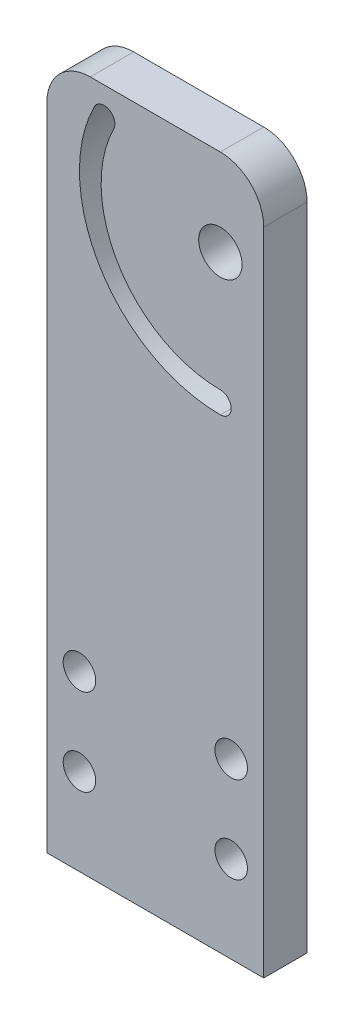
ISO-10303-21;
HEADER;
FILE_DESCRIPTION(('STEP AP214'),'2;1');
FILE_NAME('part.step','',(''),(''),'','','');
FILE_SCHEMA(('AUTOMOTIVE_DESIGN { 1 0 10303 214 1 1 1 1 }'));
ENDSEC;
DATA;
#1=APPLICATION_CONTEXT('core data for automotive mechanical design processes');
#2=APPLICATION_PROTOCOL_DEFINITION('international standard','automotive_design',2000,#1);
#3=PRODUCT_CONTEXT('',#1,'mechanical');
#4=PRODUCT('Part','Part','',(#3));
#5=PRODUCT_RELATED_PRODUCT_CATEGORY('part','',(#4));
#6=PRODUCT_DEFINITION_FORMATION('','',#4);
#7=PRODUCT_DEFINITION_CONTEXT('part definition',#1,'design');
#8=PRODUCT_DEFINITION('design','',#6,#7);
#9=PRODUCT_DEFINITION_SHAPE('','',#8);
#10=(LENGTH_UNIT() NAMED_UNIT(*) SI_UNIT(.MILLI.,.METRE.));
#11=(NAMED_UNIT(*) PLANE_ANGLE_UNIT() SI_UNIT($,.RADIAN.));
#12=(NAMED_UNIT(*) SI_UNIT($,.STERADIAN.) SOLID_ANGLE_UNIT());
#13=UNCERTAINTY_MEASURE_WITH_UNIT(LENGTH_MEASURE(1.E-05),#10,'distance_accuracy_value','');
#14=(GEOMETRIC_REPRESENTATION_CONTEXT(3) GLOBAL_UNCERTAINTY_ASSIGNED_CONTEXT((#13)) GLOBAL_UNIT_ASSIGNED_CONTEXT((#10,
#11,#12)) REPRESENTATION_CONTEXT('',''));
#15=CARTESIAN_POINT('',(0.,0.,0.));
#16=DIRECTION('',(0.,0.,1.));
#17=DIRECTION('',(1.,0.,0.));
#18=AXIS2_PLACEMENT_3D('',#15,#16,#17);
#19=CARTESIAN_POINT('',(0.,0.,6.35));
#20=DIRECTION('',(0.,0.,-1.));
#21=DIRECTION('',(-1.,0.,0.));
#22=AXIS2_PLACEMENT_3D('',#19,#20,#21);
#23=PLANE('',#22);
#24=CARTESIAN_POINT('',(26.9875,25.4,6.35));
#25=DIRECTION('',(0.,0.,1.));
#26=DIRECTION('',(1.,0.,0.));
#27=AXIS2_PLACEMENT_3D('',#24,#25,#26);
#28=CIRCLE('',#27,2.38125);
#29=CARTESIAN_POINT('',(29.36875,25.4,6.35));
#30=VERTEX_POINT('',#29);
#31=EDGE_CURVE('E343',#30,#30,#28,.T.);
#32=ORIENTED_EDGE('',*,*,#31,.F.);
#33=EDGE_LOOP('',(#32));
#34=FACE_BOUND('',#33,.T.);
#35=CARTESIAN_POINT('',(4.7625,12.7,6.35));
#36=DIRECTION('',(0.,0.,1.));
#37=DIRECTION('',(1.,0.,0.));
#38=AXIS2_PLACEMENT_3D('',#35,#36,#37);
#39=CIRCLE('',#38,2.38125);
#40=CARTESIAN_POINT('',(7.14375,12.7,6.35));
#41=VERTEX_POINT('',#40);
#42=EDGE_CURVE('E335',#41,#41,#39,.T.);
#43=ORIENTED_EDGE('',*,*,#42,.F.);
#44=EDGE_LOOP('',(#43));
#45=FACE_BOUND('',#44,.T.);
#46=CARTESIAN_POINT('',(26.9875,12.7,6.35));
#47=DIRECTION('',(0.,0.,1.));
#48=DIRECTION('',(1.,0.,0.));
#49=AXIS2_PLACEMENT_3D('',#46,#47,#48);
#50=CIRCLE('',#49,2.38125);
#51=CARTESIAN_POINT('',(29.36875,12.7,6.35));
#52=VERTEX_POINT('',#51);
#53=EDGE_CURVE('E330',#52,#52,#50,.T.);
#54=ORIENTED_EDGE('',*,*,#53,.F.);
#55=EDGE_LOOP('',(#54));
#56=FACE_BOUND('',#55,.T.);
#57=CARTESIAN_POINT('',(4.7625,25.4,6.35));
#58=DIRECTION('',(0.,0.,1.));
#59=DIRECTION('',(1.,0.,0.));
#60=AXIS2_PLACEMENT_3D('',#57,#58,#59);
#61=CIRCLE('',#60,2.38125);
#62=CARTESIAN_POINT('',(7.14375,25.4,6.35));
#63=VERTEX_POINT('',#62);
#64=EDGE_CURVE('E342',#63,#63,#61,.T.);
#65=ORIENTED_EDGE('',*,*,#64,.F.);
#66=EDGE_LOOP('',(#65));
#67=FACE_BOUND('',#66,.T.);
#68=CARTESIAN_POINT('',(25.4,88.9,6.35));
#69=DIRECTION('',(0.,0.,1.));
#70=DIRECTION('',(1.,0.,0.));
#71=AXIS2_PLACEMENT_3D('',#68,#69,#70);
#72=CIRCLE('',#71,3.175);
#73=CARTESIAN_POINT('',(28.575,88.9,6.35));
#74=VERTEX_POINT('',#73);
#75=EDGE_CURVE('E175',#74,#74,#72,.T.);
#76=ORIENTED_EDGE('',*,*,#75,.F.);
#77=EDGE_LOOP('',(#76));
#78=FACE_BOUND('',#77,.T.);
#79=DIRECTION('',(-1.,0.,0.));
#80=VECTOR('',#79,1.);
#81=CARTESIAN_POINT('',(0.,101.6,6.35));
#82=LINE('',#81,#80);
#83=CARTESIAN_POINT('',(25.4,101.6,6.35));
#84=VERTEX_POINT('',#83);
#85=CARTESIAN_POINT('',(6.35,101.6,6.35));
#86=VERTEX_POINT('',#85);
#87=EDGE_CURVE('E193',#84,#86,#82,.T.);
#88=ORIENTED_EDGE('',*,*,#87,.T.);
#89=CARTESIAN_POINT('',(6.35,95.25,6.35));
#90=DIRECTION('',(0.,0.,-1.));
#91=DIRECTION('',(-1.,0.,0.));
#92=AXIS2_PLACEMENT_3D('',#89,#90,#91);
#93=CIRCLE('',#92,6.35);
#94=CARTESIAN_POINT('',(0.,95.25,6.35));
#95=VERTEX_POINT('',#94);
#96=EDGE_CURVE('E48',#86,#95,#93,.F.);
#97=ORIENTED_EDGE('',*,*,#96,.T.);
#98=DIRECTION('',(0.,-1.,0.));
#99=VECTOR('',#98,1.);
#100=CARTESIAN_POINT('',(0.,0.,6.35));
#101=LINE('',#100,#99);
#102=CARTESIAN_POINT('',(0.,0.,6.35));
#103=VERTEX_POINT('',#102);
#104=EDGE_CURVE('E183',#95,#103,#101,.T.);
#105=ORIENTED_EDGE('',*,*,#104,.T.);
#106=DIRECTION('',(1.,0.,0.));
#107=VECTOR('',#106,1.);
#108=CARTESIAN_POINT('',(0.,0.,6.35));
#109=LINE('',#108,#107);
#110=CARTESIAN_POINT('',(31.75,0.,6.35));
#111=VERTEX_POINT('',#110);
#112=EDGE_CURVE('E186',#103,#111,#109,.T.);
#113=ORIENTED_EDGE('',*,*,#112,.T.);
#114=DIRECTION('',(0.,1.,0.));
#115=VECTOR('',#114,1.);
#116=CARTESIAN_POINT('',(31.75,0.,6.35));
#117=LINE('',#116,#115);
#118=CARTESIAN_POINT('',(31.75,95.25,6.35));
#119=VERTEX_POINT('',#118);
#120=EDGE_CURVE('E190',#111,#119,#117,.T.);
#121=ORIENTED_EDGE('',*,*,#120,.T.);
#122=CARTESIAN_POINT('',(25.4,95.25,6.35));
#123=DIRECTION('',(0.,0.,-1.));
#124=DIRECTION('',(-1.,0.,0.));
#125=AXIS2_PLACEMENT_3D('',#122,#123,#124);
#126=CIRCLE('',#125,6.35);
#127=EDGE_CURVE('E230',#119,#84,#126,.F.);
#128=ORIENTED_EDGE('',*,*,#127,.T.);
#129=EDGE_LOOP('',(#88,#97,#105,#113,#121,#128));
#130=FACE_BOUND('',#129,.T.);
#131=CARTESIAN_POINT('',(8.3611620114516,97.4194189942742,6.35));
#132=DIRECTION('',(0.,0.,1.));
#133=DIRECTION('',(1.,0.,0.));
#134=AXIS2_PLACEMENT_3D('',#131,#132,#133);
#135=CIRCLE('',#134,1.5875);
#136=CARTESIAN_POINT('',(9.78106517716398,96.709467411418,6.35));
#137=VERTEX_POINT('',#136);
#138=CARTESIAN_POINT('',(6.94125884573923,98.1293705771304,6.35));
#139=VERTEX_POINT('',#138);
#140=EDGE_CURVE('E120',#137,#139,#135,.T.);
#141=ORIENTED_EDGE('',*,*,#140,.F.);
#142=CARTESIAN_POINT('',(25.4,88.9,6.35));
#143=DIRECTION('',(0.,0.,-1.));
#144=DIRECTION('',(1.,0.,0.));
#145=AXIS2_PLACEMENT_3D('',#142,#143,#144);
#146=CIRCLE('',#145,17.4625);
#147=CARTESIAN_POINT('',(25.4,71.4375,6.35));
#148=VERTEX_POINT('',#147);
#149=EDGE_CURVE('E149',#148,#137,#146,.T.);
#150=ORIENTED_EDGE('',*,*,#149,.F.);
#151=CARTESIAN_POINT('',(25.4,69.85,6.35));
#152=DIRECTION('',(0.,0.,1.));
#153=DIRECTION('',(1.,0.,0.));
#154=AXIS2_PLACEMENT_3D('',#151,#152,#153);
#155=CIRCLE('',#154,1.58750000000001);
#156=CARTESIAN_POINT('',(25.4,68.2625,6.35));
#157=VERTEX_POINT('',#156);
#158=EDGE_CURVE('E145',#157,#148,#155,.T.);
#159=ORIENTED_EDGE('',*,*,#158,.F.);
#160=CARTESIAN_POINT('',(25.4,88.9,6.35));
#161=DIRECTION('',(0.,0.,1.));
#162=DIRECTION('',(1.,0.,0.));
#163=AXIS2_PLACEMENT_3D('',#160,#161,#162);
#164=CIRCLE('',#163,20.6375);
#165=EDGE_CURVE('E131',#139,#157,#164,.T.);
#166=ORIENTED_EDGE('',*,*,#165,.F.);
#167=EDGE_LOOP('',(#141,#150,#159,#166));
#168=FACE_BOUND('',#167,.T.);
#169=ADVANCED_FACE('F39',(#34,#45,#56,#67,#78,#130,#168),#23,.F.);
#170=CARTESIAN_POINT('',(0.,0.,0.));
#171=DIRECTION('',(0.,0.,-1.));
#172=DIRECTION('',(-1.,0.,0.));
#173=AXIS2_PLACEMENT_3D('',#170,#171,#172);
#174=PLANE('',#173);
#175=CARTESIAN_POINT('',(26.9875,25.4,0.));
#176=DIRECTION('',(0.,0.,1.));
#177=DIRECTION('',(1.,0.,0.));
#178=AXIS2_PLACEMENT_3D('',#175,#176,#177);
#179=CIRCLE('',#178,2.38125);
#180=CARTESIAN_POINT('',(29.36875,25.4,0.));
#181=VERTEX_POINT('',#180);
#182=EDGE_CURVE('E338',#181,#181,#179,.T.);
#183=ORIENTED_EDGE('',*,*,#182,.T.);
#184=EDGE_LOOP('',(#183));
#185=FACE_BOUND('',#184,.T.);
#186=CARTESIAN_POINT('',(4.7625,12.7,0.));
#187=DIRECTION('',(0.,0.,1.));
#188=DIRECTION('',(1.,0.,0.));
#189=AXIS2_PLACEMENT_3D('',#186,#187,#188);
#190=CIRCLE('',#189,2.38125);
#191=CARTESIAN_POINT('',(7.14375,12.7,0.));
#192=VERTEX_POINT('',#191);
#193=EDGE_CURVE('E347',#192,#192,#190,.T.);
#194=ORIENTED_EDGE('',*,*,#193,.T.);
#195=EDGE_LOOP('',(#194));
#196=FACE_BOUND('',#195,.T.);
#197=CARTESIAN_POINT('',(26.9875,12.7,0.));
#198=DIRECTION('',(0.,0.,1.));
#199=DIRECTION('',(1.,0.,0.));
#200=AXIS2_PLACEMENT_3D('',#197,#198,#199);
#201=CIRCLE('',#200,2.38125);
#202=CARTESIAN_POINT('',(29.36875,12.7,0.));
#203=VERTEX_POINT('',#202);
#204=EDGE_CURVE('E327',#203,#203,#201,.T.);
#205=ORIENTED_EDGE('',*,*,#204,.T.);
#206=EDGE_LOOP('',(#205));
#207=FACE_BOUND('',#206,.T.);
#208=CARTESIAN_POINT('',(4.7625,25.4,0.));
#209=DIRECTION('',(0.,0.,1.));
#210=DIRECTION('',(1.,0.,0.));
#211=AXIS2_PLACEMENT_3D('',#208,#209,#210);
#212=CIRCLE('',#211,2.38125);
#213=CARTESIAN_POINT('',(7.14375,25.4,0.));
#214=VERTEX_POINT('',#213);
#215=EDGE_CURVE('E158',#214,#214,#212,.T.);
#216=ORIENTED_EDGE('',*,*,#215,.T.);
#217=EDGE_LOOP('',(#216));
#218=FACE_BOUND('',#217,.T.);
#219=DIRECTION('',(0.,-1.,0.));
#220=VECTOR('',#219,1.);
#221=CARTESIAN_POINT('',(0.,0.,0.));
#222=LINE('',#221,#220);
#223=CARTESIAN_POINT('',(0.,95.25,0.));
#224=VERTEX_POINT('',#223);
#225=CARTESIAN_POINT('',(0.,0.,0.));
#226=VERTEX_POINT('',#225);
#227=EDGE_CURVE('E179',#224,#226,#222,.T.);
#228=ORIENTED_EDGE('',*,*,#227,.F.);
#229=CARTESIAN_POINT('',(6.35,95.25,0.));
#230=DIRECTION('',(0.,0.,-1.));
#231=DIRECTION('',(-1.,0.,0.));
#232=AXIS2_PLACEMENT_3D('',#229,#230,#231);
#233=CIRCLE('',#232,6.35);
#234=CARTESIAN_POINT('',(6.35,101.6,0.));
#235=VERTEX_POINT('',#234);
#236=EDGE_CURVE('E221',#224,#235,#233,.T.);
#237=ORIENTED_EDGE('',*,*,#236,.T.);
#238=DIRECTION('',(-1.,0.,0.));
#239=VECTOR('',#238,1.);
#240=CARTESIAN_POINT('',(0.,101.6,0.));
#241=LINE('',#240,#239);
#242=CARTESIAN_POINT('',(25.4,101.6,0.));
#243=VERTEX_POINT('',#242);
#244=EDGE_CURVE('E187',#243,#235,#241,.T.);
#245=ORIENTED_EDGE('',*,*,#244,.F.);
#246=CARTESIAN_POINT('',(25.4,95.25,0.));
#247=DIRECTION('',(0.,0.,-1.));
#248=DIRECTION('',(-1.,0.,0.));
#249=AXIS2_PLACEMENT_3D('',#246,#247,#248);
#250=CIRCLE('',#249,6.35);
#251=CARTESIAN_POINT('',(31.75,95.25,0.));
#252=VERTEX_POINT('',#251);
#253=EDGE_CURVE('E218',#243,#252,#250,.T.);
#254=ORIENTED_EDGE('',*,*,#253,.T.);
#255=DIRECTION('',(0.,1.,0.));
#256=VECTOR('',#255,1.);
#257=CARTESIAN_POINT('',(31.75,0.,0.));
#258=LINE('',#257,#256);
#259=CARTESIAN_POINT('',(31.75,0.,0.));
#260=VERTEX_POINT('',#259);
#261=EDGE_CURVE('E202',#260,#252,#258,.T.);
#262=ORIENTED_EDGE('',*,*,#261,.F.);
#263=DIRECTION('',(1.,0.,0.));
#264=VECTOR('',#263,1.);
#265=CARTESIAN_POINT('',(0.,0.,0.));
#266=LINE('',#265,#264);
#267=EDGE_CURVE('E199',#226,#260,#266,.T.);
#268=ORIENTED_EDGE('',*,*,#267,.F.);
#269=EDGE_LOOP('',(#228,#237,#245,#254,#262,#268));
#270=FACE_BOUND('',#269,.T.);
#271=CARTESIAN_POINT('',(25.4,88.9,0.));
#272=DIRECTION('',(0.,0.,1.));
#273=DIRECTION('',(1.,0.,0.));
#274=AXIS2_PLACEMENT_3D('',#271,#272,#273);
#275=CIRCLE('',#274,3.175);
#276=CARTESIAN_POINT('',(28.575,88.9,0.));
#277=VERTEX_POINT('',#276);
#278=EDGE_CURVE('E140',#277,#277,#275,.T.);
#279=ORIENTED_EDGE('',*,*,#278,.T.);
#280=EDGE_LOOP('',(#279));
#281=FACE_BOUND('',#280,.T.);
#282=CARTESIAN_POINT('',(25.4,88.9,0.));
#283=DIRECTION('',(0.,0.,-1.));
#284=DIRECTION('',(1.,0.,0.));
#285=AXIS2_PLACEMENT_3D('',#282,#283,#284);
#286=CIRCLE('',#285,17.4625);
#287=CARTESIAN_POINT('',(25.4,71.4375,0.));
#288=VERTEX_POINT('',#287);
#289=CARTESIAN_POINT('',(9.78106517716398,96.709467411418,0.));
#290=VERTEX_POINT('',#289);
#291=EDGE_CURVE('E132',#288,#290,#286,.T.);
#292=ORIENTED_EDGE('',*,*,#291,.T.);
#293=CARTESIAN_POINT('',(8.3611620114516,97.4194189942742,0.));
#294=DIRECTION('',(0.,0.,1.));
#295=DIRECTION('',(1.,0.,0.));
#296=AXIS2_PLACEMENT_3D('',#293,#294,#295);
#297=CIRCLE('',#296,1.5875);
#298=CARTESIAN_POINT('',(6.94125884573923,98.1293705771304,0.));
#299=VERTEX_POINT('',#298);
#300=EDGE_CURVE('E155',#290,#299,#297,.T.);
#301=ORIENTED_EDGE('',*,*,#300,.T.);
#302=CARTESIAN_POINT('',(25.4,88.9,0.));
#303=DIRECTION('',(0.,0.,1.));
#304=DIRECTION('',(1.,0.,0.));
#305=AXIS2_PLACEMENT_3D('',#302,#303,#304);
#306=CIRCLE('',#305,20.6375);
#307=CARTESIAN_POINT('',(25.4,68.2625,0.));
#308=VERTEX_POINT('',#307);
#309=EDGE_CURVE('E138',#299,#308,#306,.T.);
#310=ORIENTED_EDGE('',*,*,#309,.T.);
#311=CARTESIAN_POINT('',(25.4,69.85,0.));
#312=DIRECTION('',(0.,0.,1.));
#313=DIRECTION('',(1.,0.,0.));
#314=AXIS2_PLACEMENT_3D('',#311,#312,#313);
#315=CIRCLE('',#314,1.58750000000001);
#316=EDGE_CURVE('E161',#308,#288,#315,.T.);
#317=ORIENTED_EDGE('',*,*,#316,.T.);
#318=EDGE_LOOP('',(#292,#301,#310,#317));
#319=FACE_BOUND('',#318,.T.);
#320=ADVANCED_FACE('F246',(#185,#196,#207,#218,#270,#281,#319),#174,.T.);
#321=CARTESIAN_POINT('',(0.,0.,6.35));
#322=DIRECTION('',(1.,0.,0.));
#323=DIRECTION('',(0.,0.,-1.));
#324=AXIS2_PLACEMENT_3D('',#321,#322,#323);
#325=PLANE('',#324);
#326=ORIENTED_EDGE('',*,*,#104,.F.);
#327=DIRECTION('',(0.,0.,-1.));
#328=VECTOR('',#327,1.);
#329=CARTESIAN_POINT('',(0.,95.25,6.35));
#330=LINE('',#329,#328);
#331=EDGE_CURVE('E214',#95,#224,#330,.T.);
#332=ORIENTED_EDGE('',*,*,#331,.T.);
#333=ORIENTED_EDGE('',*,*,#227,.T.);
#334=DIRECTION('',(0.,0.,-1.));
#335=VECTOR('',#334,1.);
#336=CARTESIAN_POINT('',(0.,0.,6.35));
#337=LINE('',#336,#335);
#338=EDGE_CURVE('E210',#103,#226,#337,.T.);
#339=ORIENTED_EDGE('',*,*,#338,.F.);
#340=EDGE_LOOP('',(#326,#332,#333,#339));
#341=FACE_BOUND('',#340,.T.);
#342=ADVANCED_FACE('F241',(#341),#325,.F.);
#343=CARTESIAN_POINT('',(0.,0.,6.35));
#344=DIRECTION('',(0.,1.,0.));
#345=DIRECTION('',(0.,0.,1.));
#346=AXIS2_PLACEMENT_3D('',#343,#344,#345);
#347=PLANE('',#346);
#348=ORIENTED_EDGE('',*,*,#267,.T.);
#349=DIRECTION('',(0.,0.,-1.));
#350=VECTOR('',#349,1.);
#351=CARTESIAN_POINT('',(31.75,0.,6.35));
#352=LINE('',#351,#350);
#353=EDGE_CURVE('E196',#111,#260,#352,.T.);
#354=ORIENTED_EDGE('',*,*,#353,.F.);
#355=ORIENTED_EDGE('',*,*,#112,.F.);
#356=ORIENTED_EDGE('',*,*,#338,.T.);
#357=EDGE_LOOP('',(#348,#354,#355,#356));
#358=FACE_BOUND('',#357,.T.);
#359=ADVANCED_FACE('F257',(#358),#347,.F.);
#360=CARTESIAN_POINT('',(31.75,0.,6.35));
#361=DIRECTION('',(-1.,0.,0.));
#362=DIRECTION('',(0.,0.,1.));
#363=AXIS2_PLACEMENT_3D('',#360,#361,#362);
#364=PLANE('',#363);
#365=ORIENTED_EDGE('',*,*,#261,.T.);
#366=DIRECTION('',(0.,0.,-1.));
#367=VECTOR('',#366,1.);
#368=CARTESIAN_POINT('',(31.75,95.25,6.35));
#369=LINE('',#368,#367);
#370=EDGE_CURVE('E11',#252,#119,#369,.F.);
#371=ORIENTED_EDGE('',*,*,#370,.T.);
#372=ORIENTED_EDGE('',*,*,#120,.F.);
#373=ORIENTED_EDGE('',*,*,#353,.T.);
#374=EDGE_LOOP('',(#365,#371,#372,#373));
#375=FACE_BOUND('',#374,.T.);
#376=ADVANCED_FACE('F254',(#375),#364,.F.);
#377=CARTESIAN_POINT('',(0.,101.6,6.35));
#378=DIRECTION('',(0.,-1.,0.));
#379=DIRECTION('',(0.,0.,-1.));
#380=AXIS2_PLACEMENT_3D('',#377,#378,#379);
#381=PLANE('',#380);
#382=ORIENTED_EDGE('',*,*,#244,.T.);
#383=DIRECTION('',(0.,0.,-1.));
#384=VECTOR('',#383,1.);
#385=CARTESIAN_POINT('',(6.35,101.6,6.35));
#386=LINE('',#385,#384);
#387=EDGE_CURVE('E61',#235,#86,#386,.F.);
#388=ORIENTED_EDGE('',*,*,#387,.T.);
#389=ORIENTED_EDGE('',*,*,#87,.F.);
#390=DIRECTION('',(0.,0.,-1.));
#391=VECTOR('',#390,1.);
#392=CARTESIAN_POINT('',(25.4,101.6,6.35));
#393=LINE('',#392,#391);
#394=EDGE_CURVE('E224',#84,#243,#393,.T.);
#395=ORIENTED_EDGE('',*,*,#394,.T.);
#396=EDGE_LOOP('',(#382,#388,#389,#395));
#397=FACE_BOUND('',#396,.T.);
#398=ADVANCED_FACE('F249',(#397),#381,.F.);
#399=CARTESIAN_POINT('',(25.4,88.9,6.35));
#400=DIRECTION('',(0.,0.,-1.));
#401=DIRECTION('',(-1.,0.,0.));
#402=AXIS2_PLACEMENT_3D('',#399,#400,#401);
#403=CYLINDRICAL_SURFACE('',#402,3.175);
#404=ORIENTED_EDGE('',*,*,#75,.T.);
#405=EDGE_LOOP('',(#404));
#406=FACE_BOUND('',#405,.T.);
#407=ORIENTED_EDGE('',*,*,#278,.F.);
#408=EDGE_LOOP('',(#407));
#409=FACE_BOUND('',#408,.T.);
#410=ADVANCED_FACE('F277',(#406,#409),#403,.F.);
#411=CARTESIAN_POINT('',(8.3611620114516,97.4194189942742,6.35));
#412=DIRECTION('',(0.,0.,-1.));
#413=DIRECTION('',(-1.,0.,0.));
#414=AXIS2_PLACEMENT_3D('',#411,#412,#413);
#415=CYLINDRICAL_SURFACE('',#414,1.5875);
#416=ORIENTED_EDGE('',*,*,#300,.F.);
#417=DIRECTION('',(0.,0.,-1.));
#418=VECTOR('',#417,1.);
#419=CARTESIAN_POINT('',(9.78106517716398,96.709467411418,6.35));
#420=LINE('',#419,#418);
#421=EDGE_CURVE('E126',#137,#290,#420,.T.);
#422=ORIENTED_EDGE('',*,*,#421,.F.);
#423=ORIENTED_EDGE('',*,*,#140,.T.);
#424=DIRECTION('',(0.,0.,-1.));
#425=VECTOR('',#424,1.);
#426=CARTESIAN_POINT('',(6.94125884573923,98.1293705771304,6.35));
#427=LINE('',#426,#425);
#428=EDGE_CURVE('E123',#139,#299,#427,.T.);
#429=ORIENTED_EDGE('',*,*,#428,.T.);
#430=EDGE_LOOP('',(#416,#422,#423,#429));
#431=FACE_BOUND('',#430,.T.);
#432=ADVANCED_FACE('F122',(#431),#415,.F.);
#433=CARTESIAN_POINT('',(25.4,88.9,6.35));
#434=DIRECTION('',(0.,0.,-1.));
#435=DIRECTION('',(-1.,0.,0.));
#436=AXIS2_PLACEMENT_3D('',#433,#434,#435);
#437=CYLINDRICAL_SURFACE('',#436,20.6375);
#438=ORIENTED_EDGE('',*,*,#309,.F.);
#439=ORIENTED_EDGE('',*,*,#428,.F.);
#440=ORIENTED_EDGE('',*,*,#165,.T.);
#441=DIRECTION('',(0.,0.,-1.));
#442=VECTOR('',#441,1.);
#443=CARTESIAN_POINT('',(25.4,68.2625,6.35));
#444=LINE('',#443,#442);
#445=EDGE_CURVE('E141',#157,#308,#444,.T.);
#446=ORIENTED_EDGE('',*,*,#445,.T.);
#447=EDGE_LOOP('',(#438,#439,#440,#446));
#448=FACE_BOUND('',#447,.T.);
#449=ADVANCED_FACE('F135',(#448),#437,.F.);
#450=CARTESIAN_POINT('',(25.4,69.85,6.35));
#451=DIRECTION('',(0.,0.,-1.));
#452=DIRECTION('',(-1.,0.,0.));
#453=AXIS2_PLACEMENT_3D('',#450,#451,#452);
#454=CYLINDRICAL_SURFACE('',#453,1.58750000000001);
#455=ORIENTED_EDGE('',*,*,#316,.F.);
#456=ORIENTED_EDGE('',*,*,#445,.F.);
#457=ORIENTED_EDGE('',*,*,#158,.T.);
#458=DIRECTION('',(0.,0.,-1.));
#459=VECTOR('',#458,1.);
#460=CARTESIAN_POINT('',(25.4,71.4375,6.35));
#461=LINE('',#460,#459);
#462=EDGE_CURVE('E170',#148,#288,#461,.T.);
#463=ORIENTED_EDGE('',*,*,#462,.T.);
#464=EDGE_LOOP('',(#455,#456,#457,#463));
#465=FACE_BOUND('',#464,.T.);
#466=ADVANCED_FACE('F297',(#465),#454,.F.);
#467=CARTESIAN_POINT('',(25.4,88.9,6.35));
#468=DIRECTION('',(0.,0.,-1.));
#469=DIRECTION('',(-1.,0.,0.));
#470=AXIS2_PLACEMENT_3D('',#467,#468,#469);
#471=CYLINDRICAL_SURFACE('',#470,17.4625);
#472=ORIENTED_EDGE('',*,*,#291,.F.);
#473=ORIENTED_EDGE('',*,*,#462,.F.);
#474=ORIENTED_EDGE('',*,*,#149,.T.);
#475=ORIENTED_EDGE('',*,*,#421,.T.);
#476=EDGE_LOOP('',(#472,#473,#474,#475));
#477=FACE_BOUND('',#476,.T.);
#478=ADVANCED_FACE('F295',(#477),#471,.T.);
#479=CARTESIAN_POINT('',(4.7625,25.4,0.));
#480=DIRECTION('',(0.,0.,1.));
#481=DIRECTION('',(1.,0.,0.));
#482=AXIS2_PLACEMENT_3D('',#479,#480,#481);
#483=CYLINDRICAL_SURFACE('',#482,2.38125);
#484=ORIENTED_EDGE('',*,*,#215,.F.);
#485=EDGE_LOOP('',(#484));
#486=FACE_BOUND('',#485,.T.);
#487=ORIENTED_EDGE('',*,*,#64,.T.);
#488=EDGE_LOOP('',(#487));
#489=FACE_BOUND('',#488,.T.);
#490=ADVANCED_FACE('F304',(#486,#489),#483,.F.);
#491=CARTESIAN_POINT('',(26.9875,12.7,0.));
#492=DIRECTION('',(0.,0.,1.));
#493=DIRECTION('',(1.,0.,0.));
#494=AXIS2_PLACEMENT_3D('',#491,#492,#493);
#495=CYLINDRICAL_SURFACE('',#494,2.38125);
#496=ORIENTED_EDGE('',*,*,#204,.F.);
#497=EDGE_LOOP('',(#496));
#498=FACE_BOUND('',#497,.T.);
#499=ORIENTED_EDGE('',*,*,#53,.T.);
#500=EDGE_LOOP('',(#499));
#501=FACE_BOUND('',#500,.T.);
#502=ADVANCED_FACE('F310',(#498,#501),#495,.F.);
#503=CARTESIAN_POINT('',(4.7625,12.7,0.));
#504=DIRECTION('',(0.,0.,1.));
#505=DIRECTION('',(1.,0.,0.));
#506=AXIS2_PLACEMENT_3D('',#503,#504,#505);
#507=CYLINDRICAL_SURFACE('',#506,2.38125);
#508=ORIENTED_EDGE('',*,*,#193,.F.);
#509=EDGE_LOOP('',(#508));
#510=FACE_BOUND('',#509,.T.);
#511=ORIENTED_EDGE('',*,*,#42,.T.);
#512=EDGE_LOOP('',(#511));
#513=FACE_BOUND('',#512,.T.);
#514=ADVANCED_FACE('F312',(#510,#513),#507,.F.);
#515=CARTESIAN_POINT('',(26.9875,25.4,0.));
#516=DIRECTION('',(0.,0.,1.));
#517=DIRECTION('',(1.,0.,0.));
#518=AXIS2_PLACEMENT_3D('',#515,#516,#517);
#519=CYLINDRICAL_SURFACE('',#518,2.38125);
#520=ORIENTED_EDGE('',*,*,#182,.F.);
#521=EDGE_LOOP('',(#520));
#522=FACE_BOUND('',#521,.T.);
#523=ORIENTED_EDGE('',*,*,#31,.T.);
#524=EDGE_LOOP('',(#523));
#525=FACE_BOUND('',#524,.T.);
#526=ADVANCED_FACE('F315',(#522,#525),#519,.F.);
#527=CARTESIAN_POINT('',(6.35,95.25,6.35));
#528=DIRECTION('',(0.,0.,-1.));
#529=DIRECTION('',(-1.,0.,0.));
#530=AXIS2_PLACEMENT_3D('',#527,#528,#529);
#531=CYLINDRICAL_SURFACE('',#530,6.35);
#532=ORIENTED_EDGE('',*,*,#96,.F.);
#533=ORIENTED_EDGE('',*,*,#387,.F.);
#534=ORIENTED_EDGE('',*,*,#236,.F.);
#535=ORIENTED_EDGE('',*,*,#331,.F.);
#536=EDGE_LOOP('',(#532,#533,#534,#535));
#537=FACE_BOUND('',#536,.T.);
#538=ADVANCED_FACE('F243',(#537),#531,.T.);
#539=CARTESIAN_POINT('',(25.4,95.25,6.35));
#540=DIRECTION('',(0.,0.,-1.));
#541=DIRECTION('',(-1.,0.,0.));
#542=AXIS2_PLACEMENT_3D('',#539,#540,#541);
#543=CYLINDRICAL_SURFACE('',#542,6.35);
#544=ORIENTED_EDGE('',*,*,#127,.F.);
#545=ORIENTED_EDGE('',*,*,#370,.F.);
#546=ORIENTED_EDGE('',*,*,#253,.F.);
#547=ORIENTED_EDGE('',*,*,#394,.F.);
#548=EDGE_LOOP('',(#544,#545,#546,#547));
#549=FACE_BOUND('',#548,.T.);
#550=ADVANCED_FACE('F41',(#549),#543,.T.);
#551=CLOSED_SHELL('',(#169,#320,#342,#359,#376,#398,#410,#432,#449,#466,#478,#490,#502,#514,
#526,#538,#550));
#552=MANIFOLD_SOLID_BREP('B2',#551);
#553=ADVANCED_BREP_SHAPE_REPRESENTATION('',(#18,#552),#14);
#554=SHAPE_DEFINITION_REPRESENTATION(#9,#553);
ENDSEC;
END-ISO-10303-21;
